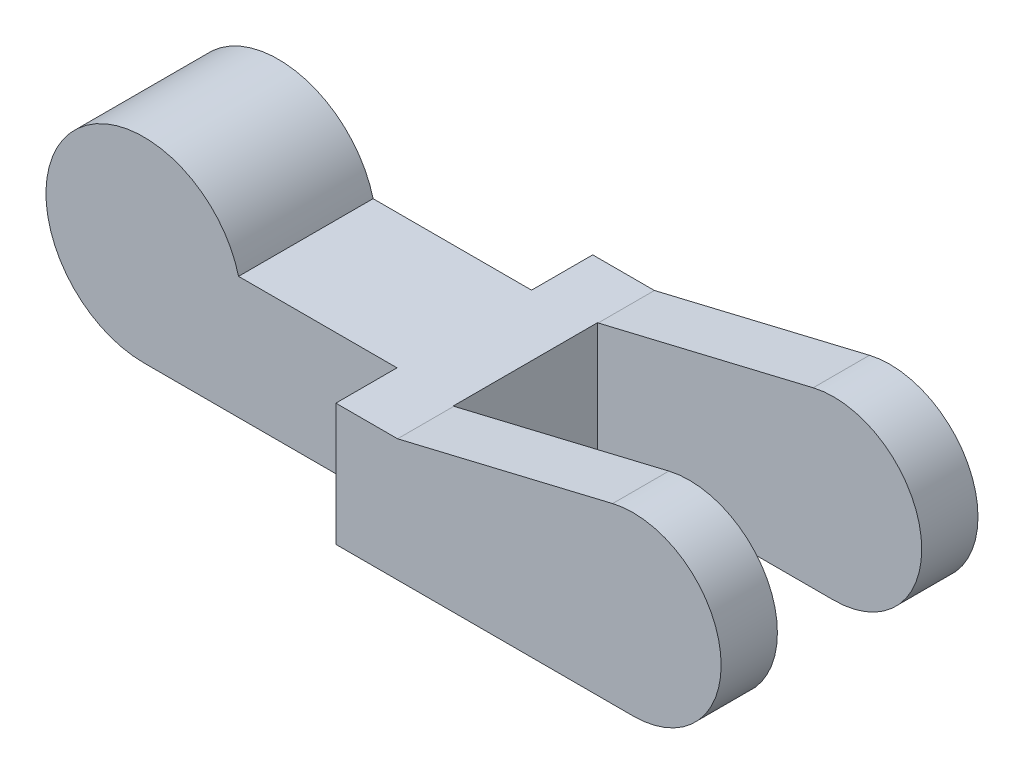
ISO-10303-21;
HEADER;
FILE_DESCRIPTION(('STEP AP214'),'2;1');
FILE_NAME('part.step','',(''),(''),'','','');
FILE_SCHEMA(('AUTOMOTIVE_DESIGN { 1 0 10303 214 1 1 1 1 }'));
ENDSEC;
DATA;
#1=APPLICATION_CONTEXT('core data for automotive mechanical design processes');
#2=APPLICATION_PROTOCOL_DEFINITION('international standard','automotive_design',2000,#1);
#3=PRODUCT_CONTEXT('',#1,'mechanical');
#4=PRODUCT('Part','Part','',(#3));
#5=PRODUCT_RELATED_PRODUCT_CATEGORY('part','',(#4));
#6=PRODUCT_DEFINITION_FORMATION('','',#4);
#7=PRODUCT_DEFINITION_CONTEXT('part definition',#1,'design');
#8=PRODUCT_DEFINITION('design','',#6,#7);
#9=PRODUCT_DEFINITION_SHAPE('','',#8);
#10=(LENGTH_UNIT() NAMED_UNIT(*) SI_UNIT(.MILLI.,.METRE.));
#11=(NAMED_UNIT(*) PLANE_ANGLE_UNIT() SI_UNIT($,.RADIAN.));
#12=(NAMED_UNIT(*) SI_UNIT($,.STERADIAN.) SOLID_ANGLE_UNIT());
#13=UNCERTAINTY_MEASURE_WITH_UNIT(LENGTH_MEASURE(1.E-05),#10,'distance_accuracy_value','');
#14=(GEOMETRIC_REPRESENTATION_CONTEXT(3) GLOBAL_UNCERTAINTY_ASSIGNED_CONTEXT((#13)) GLOBAL_UNIT_ASSIGNED_CONTEXT((#10,
#11,#12)) REPRESENTATION_CONTEXT('',''));
#15=CARTESIAN_POINT('',(0.,0.,0.));
#16=DIRECTION('',(0.,0.,1.));
#17=DIRECTION('',(1.,0.,0.));
#18=AXIS2_PLACEMENT_3D('',#15,#16,#17);
#19=CARTESIAN_POINT('',(-192.540333075851,28.0000000000071,-104.999999999999));
#20=DIRECTION('',(0.232509004540768,-0.972594243663544,0.));
#21=DIRECTION('',(-0.972594243663544,-0.232509004540768,0.));
#22=AXIS2_PLACEMENT_3D('',#19,#20,#21);
#23=PLANE('',#22);
#24=DIRECTION('',(0.,0.,1.));
#25=VECTOR('',#24,1.);
#26=CARTESIAN_POINT('',(-192.540333075851,28.0000000000071,-104.999999999999));
#27=LINE('',#26,#25);
#28=CARTESIAN_POINT('',(-192.540333075851,28.0000000000071,-104.999999999999));
#29=VERTEX_POINT('',#28);
#30=CARTESIAN_POINT('',(-192.540333075851,28.0000000000071,-58.9999999999987));
#31=VERTEX_POINT('',#30);
#32=EDGE_CURVE('E181',#29,#31,#27,.T.);
#33=ORIENTED_EDGE('',*,*,#32,.T.);
#34=DIRECTION('',(0.972594243663544,0.232509004540768,0.));
#35=VECTOR('',#34,1.);
#36=CARTESIAN_POINT('',(-192.540333075851,28.0000000000071,-58.9999999999987));
#37=LINE('',#36,#35);
#38=CARTESIAN_POINT('',(-16.7406483269357,70.0267855437752,-58.9999999999999));
#39=VERTEX_POINT('',#38);
#40=EDGE_CURVE('E224',#31,#39,#37,.T.);
#41=ORIENTED_EDGE('',*,*,#40,.T.);
#42=DIRECTION('',(0.,0.,1.));
#43=VECTOR('',#42,1.);
#44=CARTESIAN_POINT('',(-16.740648326936,70.0267855437752,-105.));
#45=LINE('',#44,#43);
#46=CARTESIAN_POINT('',(-16.740648326936,70.0267855437752,-105.));
#47=VERTEX_POINT('',#46);
#48=EDGE_CURVE('E173',#47,#39,#45,.T.);
#49=ORIENTED_EDGE('',*,*,#48,.F.);
#50=DIRECTION('',(0.972594243663544,0.232509004540768,0.));
#51=VECTOR('',#50,1.);
#52=CARTESIAN_POINT('',(-192.540333075851,28.0000000000071,-104.999999999999));
#53=LINE('',#52,#51);
#54=EDGE_CURVE('E203',#29,#47,#53,.T.);
#55=ORIENTED_EDGE('',*,*,#54,.F.);
#56=EDGE_LOOP('',(#33,#41,#49,#55));
#57=FACE_BOUND('',#56,.T.);
#58=ADVANCED_FACE('F42',(#57),#23,.F.);
#59=CARTESIAN_POINT('',(-7.33211081157058E-13,0.,-105.));
#60=DIRECTION('',(0.,0.,1.));
#61=DIRECTION('',(0.,-1.,0.));
#62=AXIS2_PLACEMENT_3D('',#59,#60,#61);
#63=CYLINDRICAL_SURFACE('',#62,72.);
#64=ORIENTED_EDGE('',*,*,#48,.T.);
#65=CARTESIAN_POINT('',(-4.1199479798349E-13,0.,-59.));
#66=DIRECTION('',(0.,0.,-1.));
#67=DIRECTION('',(-1.,0.,0.));
#68=AXIS2_PLACEMENT_3D('',#65,#66,#67);
#69=CIRCLE('',#68,72.);
#70=CARTESIAN_POINT('',(-3.04935032591043E-12,-72.,-59.));
#71=VERTEX_POINT('',#70);
#72=EDGE_CURVE('E227',#39,#71,#69,.T.);
#73=ORIENTED_EDGE('',*,*,#72,.T.);
#74=DIRECTION('',(0.,0.,1.));
#75=VECTOR('',#74,1.);
#76=CARTESIAN_POINT('',(-3.370566609084E-12,-72.,-105.));
#77=LINE('',#76,#75);
#78=CARTESIAN_POINT('',(-3.370566609084E-12,-72.,-105.));
#79=VERTEX_POINT('',#78);
#80=EDGE_CURVE('E164',#79,#71,#77,.T.);
#81=ORIENTED_EDGE('',*,*,#80,.F.);
#82=CARTESIAN_POINT('',(-7.33211081157058E-13,0.,-105.));
#83=DIRECTION('',(0.,0.,-1.));
#84=DIRECTION('',(0.,1.,0.));
#85=AXIS2_PLACEMENT_3D('',#82,#83,#84);
#86=CIRCLE('',#85,72.);
#87=EDGE_CURVE('E200',#47,#79,#86,.T.);
#88=ORIENTED_EDGE('',*,*,#87,.F.);
#89=EDGE_LOOP('',(#64,#73,#81,#88));
#90=FACE_BOUND('',#89,.T.);
#91=ADVANCED_FACE('F290',(#90),#63,.T.);
#92=CARTESIAN_POINT('',(-450.,8.00000000001648,-104.999999999997));
#93=DIRECTION('',(0.,0.,1.));
#94=DIRECTION('',(0.,-1.,0.));
#95=AXIS2_PLACEMENT_3D('',#92,#93,#94);
#96=CYLINDRICAL_SURFACE('',#95,80.);
#97=CARTESIAN_POINT('',(-450.,8.00000000001648,-54.9999999999968));
#98=DIRECTION('',(0.,0.,1.));
#99=DIRECTION('',(1.,0.,0.));
#100=AXIS2_PLACEMENT_3D('',#97,#98,#99);
#101=CIRCLE('',#100,80.);
#102=CARTESIAN_POINT('',(-372.540333075851,28.0000000000136,-54.9999999999974));
#103=VERTEX_POINT('',#102);
#104=CARTESIAN_POINT('',(-450.000000000003,-71.9999999999835,-54.9999999999968));
#105=VERTEX_POINT('',#104);
#106=EDGE_CURVE('E240',#103,#105,#101,.T.);
#107=ORIENTED_EDGE('',*,*,#106,.T.);
#108=DIRECTION('',(0.,0.,1.));
#109=VECTOR('',#108,1.);
#110=CARTESIAN_POINT('',(-450.000000000003,-71.9999999999835,-104.999999999997));
#111=LINE('',#110,#109);
#112=CARTESIAN_POINT('',(-450.000000000002,-71.9999999999835,55.0000000000031));
#113=VERTEX_POINT('',#112);
#114=EDGE_CURVE('E175',#105,#113,#111,.T.);
#115=ORIENTED_EDGE('',*,*,#114,.T.);
#116=CARTESIAN_POINT('',(-449.999999999999,8.00000000001648,55.0000000000031));
#117=DIRECTION('',(0.,0.,-1.));
#118=DIRECTION('',(-1.,0.,0.));
#119=AXIS2_PLACEMENT_3D('',#116,#117,#118);
#120=CIRCLE('',#119,80.);
#121=CARTESIAN_POINT('',(-372.54033307585,28.0000000000136,55.0000000000026));
#122=VERTEX_POINT('',#121);
#123=EDGE_CURVE('E245',#113,#122,#120,.T.);
#124=ORIENTED_EDGE('',*,*,#123,.T.);
#125=DIRECTION('',(0.,0.,1.));
#126=VECTOR('',#125,1.);
#127=CARTESIAN_POINT('',(-372.540333075851,28.0000000000136,-104.999999999997));
#128=LINE('',#127,#126);
#129=EDGE_CURVE('E184',#103,#122,#128,.T.);
#130=ORIENTED_EDGE('',*,*,#129,.F.);
#131=EDGE_LOOP('',(#107,#115,#124,#130));
#132=FACE_BOUND('',#131,.T.);
#133=ADVANCED_FACE('F44',(#132),#96,.T.);
#134=CARTESIAN_POINT('',(-372.540333075851,28.0000000000136,-104.999999999997));
#135=DIRECTION('',(0.,-1.,0.));
#136=DIRECTION('',(0.,0.,-1.));
#137=AXIS2_PLACEMENT_3D('',#134,#135,#136);
#138=PLANE('',#137);
#139=DIRECTION('',(0.,0.,-1.));
#140=VECTOR('',#139,1.);
#141=CARTESIAN_POINT('',(-193.,28.0000000000071,-104.999999999999));
#142=LINE('',#141,#140);
#143=CARTESIAN_POINT('',(-192.999999999999,28.0000000000071,59.0000000000014));
#144=VERTEX_POINT('',#143);
#145=CARTESIAN_POINT('',(-192.999999999999,28.0000000000071,-58.9999999999987));
#146=VERTEX_POINT('',#145);
#147=EDGE_CURVE('E238',#144,#146,#142,.T.);
#148=ORIENTED_EDGE('',*,*,#147,.T.);
#149=DIRECTION('',(1.,0.,0.));
#150=VECTOR('',#149,1.);
#151=CARTESIAN_POINT('',(-372.540333075851,28.0000000000136,-58.9999999999974));
#152=LINE('',#151,#150);
#153=EDGE_CURVE('E149',#146,#31,#152,.T.);
#154=ORIENTED_EDGE('',*,*,#153,.T.);
#155=ORIENTED_EDGE('',*,*,#32,.F.);
#156=DIRECTION('',(1.,0.,0.));
#157=VECTOR('',#156,1.);
#158=CARTESIAN_POINT('',(-372.540333075851,28.0000000000136,-104.999999999997));
#159=LINE('',#158,#157);
#160=CARTESIAN_POINT('',(-243.,28.0000000000089,-104.999999999998));
#161=VERTEX_POINT('',#160);
#162=EDGE_CURVE('E217',#161,#29,#159,.T.);
#163=ORIENTED_EDGE('',*,*,#162,.F.);
#164=DIRECTION('',(0.,0.,1.));
#165=VECTOR('',#164,1.);
#166=CARTESIAN_POINT('',(-243.,28.0000000000089,-104.999999999998));
#167=LINE('',#166,#165);
#168=CARTESIAN_POINT('',(-242.999999999999,28.0000000000089,-54.9999999999983));
#169=VERTEX_POINT('',#168);
#170=EDGE_CURVE('E65',#161,#169,#167,.T.);
#171=ORIENTED_EDGE('',*,*,#170,.T.);
#172=DIRECTION('',(-1.,0.,0.));
#173=VECTOR('',#172,1.);
#174=CARTESIAN_POINT('',(-372.540333075851,28.0000000000136,-54.9999999999974));
#175=LINE('',#174,#173);
#176=EDGE_CURVE('E242',#169,#103,#175,.T.);
#177=ORIENTED_EDGE('',*,*,#176,.T.);
#178=ORIENTED_EDGE('',*,*,#129,.T.);
#179=DIRECTION('',(1.,0.,0.));
#180=VECTOR('',#179,1.);
#181=CARTESIAN_POINT('',(-372.54033307585,28.0000000000136,55.0000000000026));
#182=LINE('',#181,#180);
#183=CARTESIAN_POINT('',(-242.999999999998,28.0000000000089,55.0000000000017));
#184=VERTEX_POINT('',#183);
#185=EDGE_CURVE('E247',#122,#184,#182,.T.);
#186=ORIENTED_EDGE('',*,*,#185,.T.);
#187=DIRECTION('',(0.,0.,1.));
#188=VECTOR('',#187,1.);
#189=CARTESIAN_POINT('',(-243.,28.0000000000089,-104.999999999998));
#190=LINE('',#189,#188);
#191=CARTESIAN_POINT('',(-242.999999999998,28.0000000000089,105.000000000002));
#192=VERTEX_POINT('',#191);
#193=EDGE_CURVE('E251',#184,#192,#190,.T.);
#194=ORIENTED_EDGE('',*,*,#193,.T.);
#195=DIRECTION('',(1.,0.,0.));
#196=VECTOR('',#195,1.);
#197=CARTESIAN_POINT('',(-372.54033307585,28.0000000000136,105.000000000003));
#198=LINE('',#197,#196);
#199=CARTESIAN_POINT('',(-192.54033307585,28.0000000000071,105.000000000001));
#200=VERTEX_POINT('',#199);
#201=EDGE_CURVE('E207',#192,#200,#198,.T.);
#202=ORIENTED_EDGE('',*,*,#201,.T.);
#203=CARTESIAN_POINT('',(-192.54033307585,28.0000000000071,59.0000000000014));
#204=VERTEX_POINT('',#203);
#205=EDGE_CURVE('E180',#204,#200,#27,.T.);
#206=ORIENTED_EDGE('',*,*,#205,.F.);
#207=DIRECTION('',(-1.,0.,0.));
#208=VECTOR('',#207,1.);
#209=CARTESIAN_POINT('',(-372.54033307585,28.0000000000136,59.0000000000026));
#210=LINE('',#209,#208);
#211=EDGE_CURVE('E229',#204,#144,#210,.T.);
#212=ORIENTED_EDGE('',*,*,#211,.T.);
#213=EDGE_LOOP('',(#148,#154,#155,#163,#171,#177,#178,#186,#194,#202,#206,#212));
#214=FACE_BOUND('',#213,.T.);
#215=ADVANCED_FACE('F277',(#214),#138,.F.);
#216=CARTESIAN_POINT('',(-16.7406483269349,70.0267855437752,59.0000000000002));
#217=VERTEX_POINT('',#216);
#218=CARTESIAN_POINT('',(-16.7406483269345,70.0267855437752,105.));
#219=VERTEX_POINT('',#218);
#220=EDGE_CURVE('E170',#217,#219,#45,.T.);
#221=ORIENTED_EDGE('',*,*,#220,.F.);
#222=DIRECTION('',(-0.972594243663544,-0.232509004540768,0.));
#223=VECTOR('',#222,1.);
#224=CARTESIAN_POINT('',(-192.54033307585,28.000000000007,59.0000000000014));
#225=LINE('',#224,#223);
#226=EDGE_CURVE('E232',#217,#204,#225,.T.);
#227=ORIENTED_EDGE('',*,*,#226,.T.);
#228=ORIENTED_EDGE('',*,*,#205,.T.);
#229=DIRECTION('',(0.972594243663544,0.232509004540768,0.));
#230=VECTOR('',#229,1.);
#231=CARTESIAN_POINT('',(-192.54033307585,28.0000000000071,105.000000000001));
#232=LINE('',#231,#230);
#233=EDGE_CURVE('E210',#200,#219,#232,.T.);
#234=ORIENTED_EDGE('',*,*,#233,.T.);
#235=EDGE_LOOP('',(#221,#227,#228,#234));
#236=FACE_BOUND('',#235,.T.);
#237=ADVANCED_FACE('F298',(#236),#23,.F.);
#238=CARTESIAN_POINT('',(-2.22536072994345E-12,-72.,59.));
#239=VERTEX_POINT('',#238);
#240=CARTESIAN_POINT('',(-1.90414444676989E-12,-72.,105.));
#241=VERTEX_POINT('',#240);
#242=EDGE_CURVE('E171',#239,#241,#77,.T.);
#243=ORIENTED_EDGE('',*,*,#242,.F.);
#244=CARTESIAN_POINT('',(4.1199479798349E-13,0.,59.));
#245=DIRECTION('',(0.,0.,1.));
#246=DIRECTION('',(1.,0.,0.));
#247=AXIS2_PLACEMENT_3D('',#244,#245,#246);
#248=CIRCLE('',#247,72.);
#249=EDGE_CURVE('E235',#239,#217,#248,.T.);
#250=ORIENTED_EDGE('',*,*,#249,.T.);
#251=ORIENTED_EDGE('',*,*,#220,.T.);
#252=CARTESIAN_POINT('',(7.33211081157058E-13,0.,105.));
#253=DIRECTION('',(0.,0.,-1.));
#254=DIRECTION('',(0.,1.,0.));
#255=AXIS2_PLACEMENT_3D('',#252,#253,#254);
#256=CIRCLE('',#255,72.);
#257=EDGE_CURVE('E213',#219,#241,#256,.T.);
#258=ORIENTED_EDGE('',*,*,#257,.T.);
#259=EDGE_LOOP('',(#243,#250,#251,#258));
#260=FACE_BOUND('',#259,.T.);
#261=ADVANCED_FACE('F267',(#260),#63,.T.);
#262=CARTESIAN_POINT('',(-450.000000000003,-71.9999999999835,-104.999999999997));
#263=DIRECTION('',(0.,1.,0.));
#264=DIRECTION('',(0.,0.,1.));
#265=AXIS2_PLACEMENT_3D('',#262,#263,#264);
#266=PLANE('',#265);
#267=ORIENTED_EDGE('',*,*,#80,.T.);
#268=DIRECTION('',(-1.,0.,0.));
#269=VECTOR('',#268,1.);
#270=CARTESIAN_POINT('',(-450.000000000003,-71.9999999999835,-58.9999999999968));
#271=LINE('',#270,#269);
#272=CARTESIAN_POINT('',(-193.000000000003,-71.999999999993,-58.9999999999987));
#273=VERTEX_POINT('',#272);
#274=EDGE_CURVE('E11',#71,#273,#271,.T.);
#275=ORIENTED_EDGE('',*,*,#274,.T.);
#276=DIRECTION('',(0.,0.,1.));
#277=VECTOR('',#276,1.);
#278=CARTESIAN_POINT('',(-193.000000000003,-71.999999999993,-58.9999999999987));
#279=LINE('',#278,#277);
#280=CARTESIAN_POINT('',(-193.000000000002,-71.999999999993,59.0000000000014));
#281=VERTEX_POINT('',#280);
#282=EDGE_CURVE('E155',#273,#281,#279,.T.);
#283=ORIENTED_EDGE('',*,*,#282,.T.);
#284=DIRECTION('',(1.,0.,0.));
#285=VECTOR('',#284,1.);
#286=CARTESIAN_POINT('',(108.652122341775,-72.000000000004,58.9999999999993));
#287=LINE('',#286,#285);
#288=EDGE_CURVE('E57',#281,#239,#287,.T.);
#289=ORIENTED_EDGE('',*,*,#288,.T.);
#290=ORIENTED_EDGE('',*,*,#242,.T.);
#291=DIRECTION('',(-1.,0.,0.));
#292=VECTOR('',#291,1.);
#293=CARTESIAN_POINT('',(-450.000000000002,-71.9999999999835,105.000000000003));
#294=LINE('',#293,#292);
#295=CARTESIAN_POINT('',(-243.000000000002,-71.9999999999911,105.000000000002));
#296=VERTEX_POINT('',#295);
#297=EDGE_CURVE('E215',#241,#296,#294,.T.);
#298=ORIENTED_EDGE('',*,*,#297,.T.);
#299=DIRECTION('',(0.,0.,-1.));
#300=VECTOR('',#299,1.);
#301=CARTESIAN_POINT('',(-243.000000000002,-71.9999999999911,118.240183757427));
#302=LINE('',#301,#300);
#303=CARTESIAN_POINT('',(-243.000000000002,-71.9999999999911,55.0000000000017));
#304=VERTEX_POINT('',#303);
#305=EDGE_CURVE('E254',#296,#304,#302,.T.);
#306=ORIENTED_EDGE('',*,*,#305,.T.);
#307=DIRECTION('',(-1.,0.,0.));
#308=VECTOR('',#307,1.);
#309=CARTESIAN_POINT('',(-243.000000000002,-71.9999999999911,55.0000000000017));
#310=LINE('',#309,#308);
#311=EDGE_CURVE('E256',#304,#113,#310,.T.);
#312=ORIENTED_EDGE('',*,*,#311,.T.);
#313=ORIENTED_EDGE('',*,*,#114,.F.);
#314=DIRECTION('',(1.,0.,0.));
#315=VECTOR('',#314,1.);
#316=CARTESIAN_POINT('',(-243.000000000003,-71.9999999999911,-54.9999999999983));
#317=LINE('',#316,#315);
#318=CARTESIAN_POINT('',(-243.000000000003,-71.9999999999911,-54.9999999999983));
#319=VERTEX_POINT('',#318);
#320=EDGE_CURVE('E158',#105,#319,#317,.T.);
#321=ORIENTED_EDGE('',*,*,#320,.T.);
#322=DIRECTION('',(0.,0.,-1.));
#323=VECTOR('',#322,1.);
#324=CARTESIAN_POINT('',(-243.000000000004,-71.9999999999911,-118.240183757423));
#325=LINE('',#324,#323);
#326=CARTESIAN_POINT('',(-243.000000000003,-71.9999999999911,-104.999999999998));
#327=VERTEX_POINT('',#326);
#328=EDGE_CURVE('E191',#319,#327,#325,.T.);
#329=ORIENTED_EDGE('',*,*,#328,.T.);
#330=DIRECTION('',(-1.,0.,0.));
#331=VECTOR('',#330,1.);
#332=CARTESIAN_POINT('',(-450.000000000003,-71.9999999999835,-104.999999999997));
#333=LINE('',#332,#331);
#334=EDGE_CURVE('E167',#79,#327,#333,.T.);
#335=ORIENTED_EDGE('',*,*,#334,.F.);
#336=EDGE_LOOP('',(#267,#275,#283,#289,#290,#298,#306,#312,#313,#321,#329,#335));
#337=FACE_BOUND('',#336,.T.);
#338=ADVANCED_FACE('F161',(#337),#266,.F.);
#339=CARTESIAN_POINT('',(-450.,8.00000000001648,-104.999999999997));
#340=DIRECTION('',(0.,0.,-1.));
#341=DIRECTION('',(0.,1.,0.));
#342=AXIS2_PLACEMENT_3D('',#339,#340,#341);
#343=PLANE('',#342);
#344=DIRECTION('',(0.,-1.,0.));
#345=VECTOR('',#344,1.);
#346=CARTESIAN_POINT('',(-243.,8.00000000000889,-104.999999999998));
#347=LINE('',#346,#345);
#348=EDGE_CURVE('E50',#161,#327,#347,.T.);
#349=ORIENTED_EDGE('',*,*,#348,.F.);
#350=ORIENTED_EDGE('',*,*,#162,.T.);
#351=ORIENTED_EDGE('',*,*,#54,.T.);
#352=ORIENTED_EDGE('',*,*,#87,.T.);
#353=ORIENTED_EDGE('',*,*,#334,.T.);
#354=EDGE_LOOP('',(#349,#350,#351,#352,#353));
#355=FACE_BOUND('',#354,.T.);
#356=ADVANCED_FACE('F199',(#355),#343,.T.);
#357=CARTESIAN_POINT('',(-449.999999999999,8.00000000001648,105.000000000003));
#358=DIRECTION('',(0.,0.,-1.));
#359=DIRECTION('',(0.,1.,0.));
#360=AXIS2_PLACEMENT_3D('',#357,#358,#359);
#361=PLANE('',#360);
#362=ORIENTED_EDGE('',*,*,#201,.F.);
#363=DIRECTION('',(0.,-1.,0.));
#364=VECTOR('',#363,1.);
#365=CARTESIAN_POINT('',(-242.999999999999,8.00000000000889,105.000000000002));
#366=LINE('',#365,#364);
#367=EDGE_CURVE('E187',#192,#296,#366,.T.);
#368=ORIENTED_EDGE('',*,*,#367,.T.);
#369=ORIENTED_EDGE('',*,*,#297,.F.);
#370=ORIENTED_EDGE('',*,*,#257,.F.);
#371=ORIENTED_EDGE('',*,*,#233,.F.);
#372=EDGE_LOOP('',(#362,#368,#369,#370,#371));
#373=FACE_BOUND('',#372,.T.);
#374=ADVANCED_FACE('F273',(#373),#361,.F.);
#375=CARTESIAN_POINT('',(-243.000000000002,-71.9999999999911,55.0000000000017));
#376=DIRECTION('',(0.,0.,-1.));
#377=DIRECTION('',(-1.,0.,0.));
#378=AXIS2_PLACEMENT_3D('',#375,#376,#377);
#379=PLANE('',#378);
#380=ORIENTED_EDGE('',*,*,#311,.F.);
#381=DIRECTION('',(0.,1.,0.));
#382=VECTOR('',#381,1.);
#383=CARTESIAN_POINT('',(-243.000000000002,-71.9999999999911,55.0000000000017));
#384=LINE('',#383,#382);
#385=EDGE_CURVE('E259',#304,#184,#384,.T.);
#386=ORIENTED_EDGE('',*,*,#385,.T.);
#387=ORIENTED_EDGE('',*,*,#185,.F.);
#388=ORIENTED_EDGE('',*,*,#123,.F.);
#389=EDGE_LOOP('',(#380,#386,#387,#388));
#390=FACE_BOUND('',#389,.T.);
#391=ADVANCED_FACE('F283',(#390),#379,.F.);
#392=CARTESIAN_POINT('',(-243.000000000002,-71.9999999999911,118.240183757427));
#393=DIRECTION('',(1.,0.,0.));
#394=DIRECTION('',(0.,0.,-1.));
#395=AXIS2_PLACEMENT_3D('',#392,#393,#394);
#396=PLANE('',#395);
#397=ORIENTED_EDGE('',*,*,#385,.F.);
#398=ORIENTED_EDGE('',*,*,#305,.F.);
#399=ORIENTED_EDGE('',*,*,#367,.F.);
#400=ORIENTED_EDGE('',*,*,#193,.F.);
#401=EDGE_LOOP('',(#397,#398,#399,#400));
#402=FACE_BOUND('',#401,.T.);
#403=ADVANCED_FACE('F275',(#402),#396,.F.);
#404=CARTESIAN_POINT('',(-243.000000000003,-71.9999999999911,-54.9999999999983));
#405=DIRECTION('',(0.,0.,1.));
#406=DIRECTION('',(1.,0.,0.));
#407=AXIS2_PLACEMENT_3D('',#404,#405,#406);
#408=PLANE('',#407);
#409=ORIENTED_EDGE('',*,*,#106,.F.);
#410=ORIENTED_EDGE('',*,*,#176,.F.);
#411=DIRECTION('',(0.,1.,0.));
#412=VECTOR('',#411,1.);
#413=CARTESIAN_POINT('',(-243.000000000003,-71.9999999999911,-54.9999999999983));
#414=LINE('',#413,#412);
#415=EDGE_CURVE('E197',#319,#169,#414,.T.);
#416=ORIENTED_EDGE('',*,*,#415,.F.);
#417=ORIENTED_EDGE('',*,*,#320,.F.);
#418=EDGE_LOOP('',(#409,#410,#416,#417));
#419=FACE_BOUND('',#418,.T.);
#420=ADVANCED_FACE('F286',(#419),#408,.F.);
#421=CARTESIAN_POINT('',(-243.000000000004,-71.9999999999911,-118.240183757423));
#422=DIRECTION('',(1.,0.,0.));
#423=DIRECTION('',(0.,0.,-1.));
#424=AXIS2_PLACEMENT_3D('',#421,#422,#423);
#425=PLANE('',#424);
#426=ORIENTED_EDGE('',*,*,#348,.T.);
#427=ORIENTED_EDGE('',*,*,#328,.F.);
#428=ORIENTED_EDGE('',*,*,#415,.T.);
#429=ORIENTED_EDGE('',*,*,#170,.F.);
#430=EDGE_LOOP('',(#426,#427,#428,#429));
#431=FACE_BOUND('',#430,.T.);
#432=ADVANCED_FACE('F190',(#431),#425,.F.);
#433=CARTESIAN_POINT('',(108.652122341775,-72.000000000004,-59.0000000000008));
#434=DIRECTION('',(0.,0.,-1.));
#435=DIRECTION('',(-1.,0.,0.));
#436=AXIS2_PLACEMENT_3D('',#433,#434,#435);
#437=PLANE('',#436);
#438=DIRECTION('',(0.,1.,0.));
#439=VECTOR('',#438,1.);
#440=CARTESIAN_POINT('',(-193.000000000003,-71.999999999993,-58.9999999999987));
#441=LINE('',#440,#439);
#442=EDGE_CURVE('E144',#273,#146,#441,.T.);
#443=ORIENTED_EDGE('',*,*,#442,.F.);
#444=ORIENTED_EDGE('',*,*,#274,.F.);
#445=ORIENTED_EDGE('',*,*,#72,.F.);
#446=ORIENTED_EDGE('',*,*,#40,.F.);
#447=ORIENTED_EDGE('',*,*,#153,.F.);
#448=EDGE_LOOP('',(#443,#444,#445,#446,#447));
#449=FACE_BOUND('',#448,.T.);
#450=ADVANCED_FACE('F146',(#449),#437,.F.);
#451=CARTESIAN_POINT('',(108.652122341775,-72.000000000004,58.9999999999993));
#452=DIRECTION('',(0.,0.,1.));
#453=DIRECTION('',(1.,0.,0.));
#454=AXIS2_PLACEMENT_3D('',#451,#452,#453);
#455=PLANE('',#454);
#456=ORIENTED_EDGE('',*,*,#226,.F.);
#457=ORIENTED_EDGE('',*,*,#249,.F.);
#458=ORIENTED_EDGE('',*,*,#288,.F.);
#459=DIRECTION('',(0.,1.,0.));
#460=VECTOR('',#459,1.);
#461=CARTESIAN_POINT('',(-193.000000000002,-71.999999999993,59.0000000000014));
#462=LINE('',#461,#460);
#463=EDGE_CURVE('E152',#281,#144,#462,.T.);
#464=ORIENTED_EDGE('',*,*,#463,.T.);
#465=ORIENTED_EDGE('',*,*,#211,.F.);
#466=EDGE_LOOP('',(#456,#457,#458,#464,#465));
#467=FACE_BOUND('',#466,.T.);
#468=ADVANCED_FACE('F309',(#467),#455,.F.);
#469=CARTESIAN_POINT('',(-193.000000000003,-71.999999999993,-58.9999999999987));
#470=DIRECTION('',(-1.,0.,0.));
#471=DIRECTION('',(0.,0.,1.));
#472=AXIS2_PLACEMENT_3D('',#469,#470,#471);
#473=PLANE('',#472);
#474=ORIENTED_EDGE('',*,*,#463,.F.);
#475=ORIENTED_EDGE('',*,*,#282,.F.);
#476=ORIENTED_EDGE('',*,*,#442,.T.);
#477=ORIENTED_EDGE('',*,*,#147,.F.);
#478=EDGE_LOOP('',(#474,#475,#476,#477));
#479=FACE_BOUND('',#478,.T.);
#480=ADVANCED_FACE('F156',(#479),#473,.F.);
#481=CLOSED_SHELL('',(#58,#91,#133,#215,#237,#261,#338,#356,#374,#391,#403,#420,#432,#450,#468,#480));
#482=MANIFOLD_SOLID_BREP('B2',#481);
#483=ADVANCED_BREP_SHAPE_REPRESENTATION('',(#18,#482),#14);
#484=SHAPE_DEFINITION_REPRESENTATION(#9,#483);
ENDSEC;
END-ISO-10303-21;
